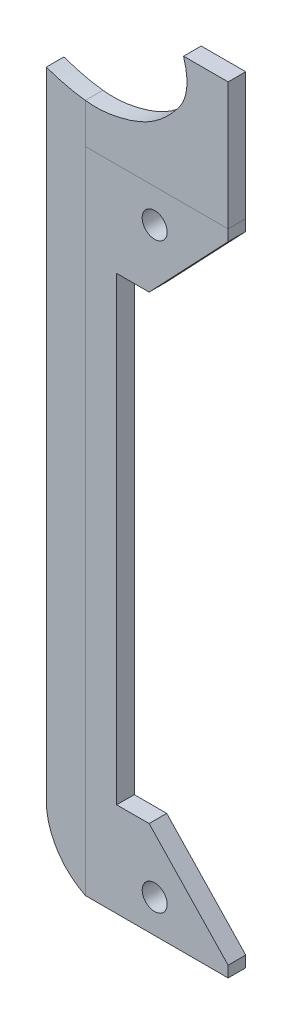
ISO-10303-21;
HEADER;
FILE_DESCRIPTION(('STEP AP214'),'2;1');
FILE_NAME('part.step','',(''),(''),'','','');
FILE_SCHEMA(('AUTOMOTIVE_DESIGN { 1 0 10303 214 1 1 1 1 }'));
ENDSEC;
DATA;
#1=APPLICATION_CONTEXT('core data for automotive mechanical design processes');
#2=APPLICATION_PROTOCOL_DEFINITION('international standard','automotive_design',2000,#1);
#3=PRODUCT_CONTEXT('',#1,'mechanical');
#4=PRODUCT('Part','Part','',(#3));
#5=PRODUCT_RELATED_PRODUCT_CATEGORY('part','',(#4));
#6=PRODUCT_DEFINITION_FORMATION('','',#4);
#7=PRODUCT_DEFINITION_CONTEXT('part definition',#1,'design');
#8=PRODUCT_DEFINITION('design','',#6,#7);
#9=PRODUCT_DEFINITION_SHAPE('','',#8);
#10=(LENGTH_UNIT() NAMED_UNIT(*) SI_UNIT(.MILLI.,.METRE.));
#11=(NAMED_UNIT(*) PLANE_ANGLE_UNIT() SI_UNIT($,.RADIAN.));
#12=(NAMED_UNIT(*) SI_UNIT($,.STERADIAN.) SOLID_ANGLE_UNIT());
#13=UNCERTAINTY_MEASURE_WITH_UNIT(LENGTH_MEASURE(1.E-05),#10,'distance_accuracy_value','');
#14=(GEOMETRIC_REPRESENTATION_CONTEXT(3) GLOBAL_UNCERTAINTY_ASSIGNED_CONTEXT((#13)) GLOBAL_UNIT_ASSIGNED_CONTEXT((#10,
#11,#12)) REPRESENTATION_CONTEXT('',''));
#15=CARTESIAN_POINT('',(0.,0.,0.));
#16=DIRECTION('',(0.,0.,1.));
#17=DIRECTION('',(1.,0.,0.));
#18=AXIS2_PLACEMENT_3D('',#15,#16,#17);
#19=CARTESIAN_POINT('',(0.,0.,3.17499999999992));
#20=DIRECTION('',(0.,0.,-1.));
#21=DIRECTION('',(-1.,0.,0.));
#22=AXIS2_PLACEMENT_3D('',#19,#20,#21);
#23=PLANE('',#22);
#24=DIRECTION('',(0.,1.,0.));
#25=VECTOR('',#24,1.);
#26=CARTESIAN_POINT('',(-497.05,1.49999999999986,3.17499999999995));
#27=LINE('',#26,#25);
#28=CARTESIAN_POINT('',(-497.05,12.8739834710622,3.17499999999992));
#29=VERTEX_POINT('',#28);
#30=CARTESIAN_POINT('',(-497.05,127.374197193381,3.17499999999989));
#31=VERTEX_POINT('',#30);
#32=EDGE_CURVE('E274',#29,#31,#27,.T.);
#33=ORIENTED_EDGE('',*,*,#32,.F.);
#34=CARTESIAN_POINT('',(-484.35,12.8739834710622,3.17499999999992));
#35=DIRECTION('',(0.,0.,-1.));
#36=DIRECTION('',(-1.,0.,0.));
#37=AXIS2_PLACEMENT_3D('',#34,#35,#36);
#38=CIRCLE('',#37,12.7);
#39=CARTESIAN_POINT('',(-490.,1.49999999999986,3.17499999999997));
#40=VERTEX_POINT('',#39);
#41=EDGE_CURVE('E223',#29,#40,#38,.F.);
#42=ORIENTED_EDGE('',*,*,#41,.T.);
#43=DIRECTION('',(0.,1.,0.));
#44=VECTOR('',#43,1.);
#45=CARTESIAN_POINT('',(-490.,1.49999999999986,3.17499999999997));
#46=LINE('',#45,#44);
#47=CARTESIAN_POINT('',(-490.,125.685646759831,3.17499999999996));
#48=VERTEX_POINT('',#47);
#49=EDGE_CURVE('E277',#40,#48,#46,.T.);
#50=ORIENTED_EDGE('',*,*,#49,.T.);
#51=CARTESIAN_POINT('',(-472.286101811835,141.459761952969,3.17499999999992));
#52=CARTESIAN_POINT('',(-471.839311887975,139.996705848872,3.17499999999992));
#53=CARTESIAN_POINT('',(-471.44648237646,137.633072790387,3.17499999999992));
#54=CARTESIAN_POINT('',(-472.167376182058,134.273923046449,3.17499999999992));
#55=CARTESIAN_POINT('',(-473.81996088809,132.089102364911,3.17499999999992));
#56=CARTESIAN_POINT('',(-476.035631474165,129.72626131313,3.17499999999992));
#57=CARTESIAN_POINT('',(-478.913541328163,127.696041035695,3.17499999999992));
#58=CARTESIAN_POINT('',(-482.871983039689,126.231214629087,3.17499999999992));
#59=CARTESIAN_POINT('',(-488.965357723436,125.016223815304,3.17499999999992));
#60=CARTESIAN_POINT('',(-493.945609682446,126.322089579912,3.17499999999992));
#61=CARTESIAN_POINT('',(-497.05,127.374197193381,3.17499999999992));
#62=B_SPLINE_CURVE_WITH_KNOTS('',3,(#51,#52,#53,#54,#55,#56,#57,#58,#59,#60,#61),.UNSPECIFIED.,
.F.,.F.,(4,1,1,1,1,1,1,1,4),(0.,0.129736074714372,0.200847285493994,0.285412728854933,
0.358404023451765,0.477149407655144,0.580374686409033,0.716214990321223,1.),.UNSPECIFIED.);
#63=EDGE_CURVE('E261',#48,#31,#62,.T.);
#64=ORIENTED_EDGE('',*,*,#63,.T.);
#65=EDGE_LOOP('',(#33,#42,#50,#64));
#66=FACE_BOUND('',#65,.T.);
#67=ADVANCED_FACE('F214',(#66),#23,.F.);
#68=CARTESIAN_POINT('',(0.,0.,0.));
#69=DIRECTION('',(0.,0.,-1.));
#70=DIRECTION('',(-1.,0.,0.));
#71=AXIS2_PLACEMENT_3D('',#68,#69,#70);
#72=PLANE('',#71);
#73=DIRECTION('',(0.,1.,0.));
#74=VECTOR('',#73,1.);
#75=CARTESIAN_POINT('',(-490.,1.49999999999986,0.));
#76=LINE('',#75,#74);
#77=CARTESIAN_POINT('',(-490.,1.49999999999986,0.));
#78=VERTEX_POINT('',#77);
#79=CARTESIAN_POINT('',(-490.,125.685646759831,0.));
#80=VERTEX_POINT('',#79);
#81=EDGE_CURVE('E268',#78,#80,#76,.T.);
#82=ORIENTED_EDGE('',*,*,#81,.F.);
#83=CARTESIAN_POINT('',(-484.35,12.8739834710622,0.));
#84=DIRECTION('',(0.,0.,-1.));
#85=DIRECTION('',(-1.,0.,0.));
#86=AXIS2_PLACEMENT_3D('',#83,#84,#85);
#87=CIRCLE('',#86,12.7);
#88=CARTESIAN_POINT('',(-497.05,12.8739834710622,0.));
#89=VERTEX_POINT('',#88);
#90=EDGE_CURVE('E13',#78,#89,#87,.T.);
#91=ORIENTED_EDGE('',*,*,#90,.T.);
#92=DIRECTION('',(0.,1.,0.));
#93=VECTOR('',#92,1.);
#94=CARTESIAN_POINT('',(-497.05,1.49999999999986,0.));
#95=LINE('',#94,#93);
#96=CARTESIAN_POINT('',(-497.05,127.374197193381,-1.12005588560687E-13));
#97=VERTEX_POINT('',#96);
#98=EDGE_CURVE('E270',#89,#97,#95,.T.);
#99=ORIENTED_EDGE('',*,*,#98,.T.);
#100=CARTESIAN_POINT('',(-472.286101811835,141.459761952969,0.));
#101=CARTESIAN_POINT('',(-471.839311887975,139.996705848872,0.));
#102=CARTESIAN_POINT('',(-471.44648237646,137.633072790387,0.));
#103=CARTESIAN_POINT('',(-472.167376182058,134.273923046449,0.));
#104=CARTESIAN_POINT('',(-473.81996088809,132.089102364911,0.));
#105=CARTESIAN_POINT('',(-476.035631474165,129.72626131313,0.));
#106=CARTESIAN_POINT('',(-478.913541328163,127.696041035695,0.));
#107=CARTESIAN_POINT('',(-482.871983039689,126.231214629087,0.));
#108=CARTESIAN_POINT('',(-488.965357723436,125.016223815304,0.));
#109=CARTESIAN_POINT('',(-493.945609682446,126.322089579912,0.));
#110=CARTESIAN_POINT('',(-497.05,127.374197193381,0.));
#111=B_SPLINE_CURVE_WITH_KNOTS('',3,(#100,#101,#102,#103,#104,#105,#106,#107,#108,#109,#110),
.UNSPECIFIED.,.F.,.F.,(4,1,1,1,1,1,1,1,4),(0.,0.129736074714372,0.200847285493994,
0.285412728854933,0.358404023451765,0.477149407655144,0.580374686409033,0.716214990321223,1.),.UNSPECIFIED.);
#112=EDGE_CURVE('E258',#80,#97,#111,.T.);
#113=ORIENTED_EDGE('',*,*,#112,.F.);
#114=EDGE_LOOP('',(#82,#91,#99,#113));
#115=FACE_BOUND('',#114,.T.);
#116=ADVANCED_FACE('F267',(#115),#72,.T.);
#117=CARTESIAN_POINT('',(-490.,1.49999999999986,0.));
#118=DIRECTION('',(1.,0.,0.));
#119=DIRECTION('',(0.,1.,0.));
#120=AXIS2_PLACEMENT_3D('',#117,#118,#119);
#121=PLANE('',#120);
#122=DIRECTION('',(0.,0.,-1.));
#123=VECTOR('',#122,1.);
#124=CARTESIAN_POINT('',(-490.,125.685646759831,6.858));
#125=LINE('',#124,#123);
#126=EDGE_CURVE('E254',#48,#80,#125,.T.);
#127=ORIENTED_EDGE('',*,*,#126,.F.);
#128=ORIENTED_EDGE('',*,*,#49,.F.);
#129=DIRECTION('',(0.,0.,1.));
#130=VECTOR('',#129,1.);
#131=CARTESIAN_POINT('',(-490.,1.49999999999986,0.));
#132=LINE('',#131,#130);
#133=EDGE_CURVE('E273',#78,#40,#132,.T.);
#134=ORIENTED_EDGE('',*,*,#133,.F.);
#135=ORIENTED_EDGE('',*,*,#81,.T.);
#136=EDGE_LOOP('',(#127,#128,#134,#135));
#137=FACE_BOUND('',#136,.T.);
#138=ADVANCED_FACE('F272',(#137),#121,.T.);
#139=CARTESIAN_POINT('',(-497.05,1.49999999999986,0.));
#140=DIRECTION('',(1.,0.,0.));
#141=DIRECTION('',(0.,0.,-1.));
#142=AXIS2_PLACEMENT_3D('',#139,#140,#141);
#143=PLANE('',#142);
#144=ORIENTED_EDGE('',*,*,#98,.F.);
#145=DIRECTION('',(0.,0.,-1.));
#146=VECTOR('',#145,1.);
#147=CARTESIAN_POINT('',(-497.05,12.8739834710622,0.));
#148=LINE('',#147,#146);
#149=EDGE_CURVE('E292',#89,#29,#148,.F.);
#150=ORIENTED_EDGE('',*,*,#149,.T.);
#151=ORIENTED_EDGE('',*,*,#32,.T.);
#152=DIRECTION('',(0.,0.,-1.));
#153=VECTOR('',#152,1.);
#154=CARTESIAN_POINT('',(-497.05,127.374197193381,6.858));
#155=LINE('',#154,#153);
#156=EDGE_CURVE('E289',#31,#97,#155,.T.);
#157=ORIENTED_EDGE('',*,*,#156,.T.);
#158=EDGE_LOOP('',(#144,#150,#151,#157));
#159=FACE_BOUND('',#158,.T.);
#160=ADVANCED_FACE('F299',(#159),#143,.F.);
#161=CARTESIAN_POINT('',(-472.286101811835,141.459761952969,6.858));
#162=CARTESIAN_POINT('',(-471.839311887975,139.996705848872,6.858));
#163=CARTESIAN_POINT('',(-471.44648237646,137.633072790387,6.858));
#164=CARTESIAN_POINT('',(-472.167376182058,134.273923046449,6.858));
#165=CARTESIAN_POINT('',(-473.81996088809,132.089102364911,6.858));
#166=CARTESIAN_POINT('',(-476.035631474165,129.72626131313,6.858));
#167=CARTESIAN_POINT('',(-478.913541328163,127.696041035695,6.858));
#168=CARTESIAN_POINT('',(-482.871983039689,126.231214629087,6.858));
#169=CARTESIAN_POINT('',(-488.965357723436,125.016223815304,6.858));
#170=CARTESIAN_POINT('',(-493.945609682446,126.322089579912,6.858));
#171=CARTESIAN_POINT('',(-497.05,127.374197193381,6.858));
#172=B_SPLINE_CURVE_WITH_KNOTS('',3,(#161,#162,#163,#164,#165,#166,#167,#168,#169,#170,#171),
.UNSPECIFIED.,.F.,.F.,(4,1,1,1,1,1,1,1,4),(0.,0.129736074714372,0.200847285493994,
0.285412728854933,0.358404023451765,0.477149407655144,0.580374686409033,0.716214990321223,1.),.UNSPECIFIED.);
#173=DIRECTION('',(0.,0.,-1.));
#174=VECTOR('',#173,1.);
#175=SURFACE_OF_LINEAR_EXTRUSION('',#172,#174);
#176=ORIENTED_EDGE('',*,*,#126,.T.);
#177=ORIENTED_EDGE('',*,*,#112,.T.);
#178=ORIENTED_EDGE('',*,*,#156,.F.);
#179=ORIENTED_EDGE('',*,*,#63,.F.);
#180=EDGE_LOOP('',(#176,#177,#178,#179));
#181=FACE_BOUND('',#180,.T.);
#182=ADVANCED_FACE('F256',(#181),#175,.F.);
#183=CARTESIAN_POINT('',(-484.35,12.8739834710622,0.));
#184=DIRECTION('',(0.,0.,-1.));
#185=DIRECTION('',(-1.,0.,0.));
#186=AXIS2_PLACEMENT_3D('',#183,#184,#185);
#187=CYLINDRICAL_SURFACE('',#186,12.7);
#188=ORIENTED_EDGE('',*,*,#90,.F.);
#189=ORIENTED_EDGE('',*,*,#133,.T.);
#190=ORIENTED_EDGE('',*,*,#41,.F.);
#191=ORIENTED_EDGE('',*,*,#149,.F.);
#192=EDGE_LOOP('',(#188,#189,#190,#191));
#193=FACE_BOUND('',#192,.T.);
#194=ADVANCED_FACE('F216',(#193),#187,.T.);
#195=CLOSED_SHELL('',(#67,#116,#138,#160,#182,#194));
#196=MANIFOLD_SOLID_BREP('B2',#195);
#197=CARTESIAN_POINT('',(0.,0.,3.17499999999997));
#198=DIRECTION('',(0.,0.,-1.));
#199=DIRECTION('',(-1.,0.,0.));
#200=AXIS2_PLACEMENT_3D('',#197,#198,#199);
#201=PLANE('',#200);
#202=DIRECTION('',(1.,0.,0.));
#203=VECTOR('',#202,1.);
#204=CARTESIAN_POINT('',(-490.,141.459761952969,3.17499999999996));
#205=LINE('',#204,#203);
#206=CARTESIAN_POINT('',(-472.286101811835,141.459761952969,3.17499999999997));
#207=VERTEX_POINT('',#206);
#208=CARTESIAN_POINT('',(-464.25,141.459761952969,3.17499999999998));
#209=VERTEX_POINT('',#208);
#210=EDGE_CURVE('E441',#207,#209,#205,.T.);
#211=ORIENTED_EDGE('',*,*,#210,.F.);
#212=CARTESIAN_POINT('',(-472.286101811835,141.459761952969,3.17499999999997));
#213=CARTESIAN_POINT('',(-471.839311887975,139.996705848872,3.17499999999997));
#214=CARTESIAN_POINT('',(-471.44648237646,137.633072790387,3.17499999999997));
#215=CARTESIAN_POINT('',(-472.167376182058,134.273923046449,3.17499999999997));
#216=CARTESIAN_POINT('',(-473.81996088809,132.089102364911,3.17499999999997));
#217=CARTESIAN_POINT('',(-476.035631474165,129.72626131313,3.17499999999997));
#218=CARTESIAN_POINT('',(-478.913541328163,127.696041035695,3.17499999999997));
#219=CARTESIAN_POINT('',(-482.871983039689,126.231214629087,3.17499999999997));
#220=CARTESIAN_POINT('',(-488.965357723436,125.016223815304,3.17499999999997));
#221=CARTESIAN_POINT('',(-493.945609682446,126.322089579912,3.17499999999997));
#222=CARTESIAN_POINT('',(-497.05,127.374197193381,3.17499999999997));
#223=B_SPLINE_CURVE_WITH_KNOTS('',3,(#212,#213,#214,#215,#216,#217,#218,#219,#220,#221,#222),
.UNSPECIFIED.,.F.,.F.,(4,1,1,1,1,1,1,1,4),(0.,0.129736074714372,0.200847285493994,
0.285412728854933,0.358404023451765,0.477149407655144,0.580374686409033,0.716214990321223,1.),.UNSPECIFIED.);
#224=CARTESIAN_POINT('',(-490.,125.685646759831,3.17499999999997));
#225=VERTEX_POINT('',#224);
#226=EDGE_CURVE('E391',#207,#225,#223,.T.);
#227=ORIENTED_EDGE('',*,*,#226,.T.);
#228=DIRECTION('',(0.,1.,0.));
#229=VECTOR('',#228,1.);
#230=CARTESIAN_POINT('',(-490.,118.5,3.17499999999997));
#231=LINE('',#230,#229);
#232=CARTESIAN_POINT('',(-490.,118.5,3.17499999999997));
#233=VERTEX_POINT('',#232);
#234=EDGE_CURVE('E459',#233,#225,#231,.T.);
#235=ORIENTED_EDGE('',*,*,#234,.F.);
#236=DIRECTION('',(1.,0.,0.));
#237=VECTOR('',#236,1.);
#238=CARTESIAN_POINT('',(-490.,118.5,3.17499999999997));
#239=LINE('',#238,#237);
#240=CARTESIAN_POINT('',(-464.25,118.5,3.17499999999997));
#241=VERTEX_POINT('',#240);
#242=EDGE_CURVE('E420',#233,#241,#239,.T.);
#243=ORIENTED_EDGE('',*,*,#242,.T.);
#244=DIRECTION('',(0.,1.,0.));
#245=VECTOR('',#244,1.);
#246=CARTESIAN_POINT('',(-464.25,118.5,3.17499999999997));
#247=LINE('',#246,#245);
#248=EDGE_CURVE('E453',#241,#209,#247,.T.);
#249=ORIENTED_EDGE('',*,*,#248,.T.);
#250=EDGE_LOOP('',(#211,#227,#235,#243,#249));
#251=FACE_BOUND('',#250,.T.);
#252=ADVANCED_FACE('F377',(#251),#201,.F.);
#253=CARTESIAN_POINT('',(0.,0.,0.));
#254=DIRECTION('',(0.,0.,-1.));
#255=DIRECTION('',(-1.,0.,0.));
#256=AXIS2_PLACEMENT_3D('',#253,#254,#255);
#257=PLANE('',#256);
#258=CARTESIAN_POINT('',(-472.286101811835,141.459761952969,0.));
#259=CARTESIAN_POINT('',(-471.839311887975,139.996705848872,0.));
#260=CARTESIAN_POINT('',(-471.44648237646,137.633072790387,0.));
#261=CARTESIAN_POINT('',(-472.167376182058,134.273923046449,0.));
#262=CARTESIAN_POINT('',(-473.81996088809,132.089102364911,0.));
#263=CARTESIAN_POINT('',(-476.035631474165,129.72626131313,0.));
#264=CARTESIAN_POINT('',(-478.913541328163,127.696041035695,0.));
#265=CARTESIAN_POINT('',(-482.871983039689,126.231214629087,0.));
#266=CARTESIAN_POINT('',(-488.965357723436,125.016223815304,0.));
#267=CARTESIAN_POINT('',(-493.945609682446,126.322089579912,0.));
#268=CARTESIAN_POINT('',(-497.05,127.374197193381,0.));
#269=B_SPLINE_CURVE_WITH_KNOTS('',3,(#258,#259,#260,#261,#262,#263,#264,#265,#266,#267,#268),
.UNSPECIFIED.,.F.,.F.,(4,1,1,1,1,1,1,1,4),(0.,0.129736074714372,0.200847285493994,
0.285412728854933,0.358404023451765,0.477149407655144,0.580374686409033,0.716214990321223,1.),.UNSPECIFIED.);
#270=CARTESIAN_POINT('',(-472.286101811835,141.459761952969,0.));
#271=VERTEX_POINT('',#270);
#272=CARTESIAN_POINT('',(-490.,125.685646759831,0.));
#273=VERTEX_POINT('',#272);
#274=EDGE_CURVE('E427',#271,#273,#269,.T.);
#275=ORIENTED_EDGE('',*,*,#274,.F.);
#276=DIRECTION('',(1.,0.,0.));
#277=VECTOR('',#276,1.);
#278=CARTESIAN_POINT('',(-490.,141.459761952969,0.));
#279=LINE('',#278,#277);
#280=CARTESIAN_POINT('',(-464.25,141.459761952969,0.));
#281=VERTEX_POINT('',#280);
#282=EDGE_CURVE('E384',#271,#281,#279,.T.);
#283=ORIENTED_EDGE('',*,*,#282,.T.);
#284=DIRECTION('',(0.,1.,0.));
#285=VECTOR('',#284,1.);
#286=CARTESIAN_POINT('',(-464.25,118.5,0.));
#287=LINE('',#286,#285);
#288=CARTESIAN_POINT('',(-464.25,118.5,0.));
#289=VERTEX_POINT('',#288);
#290=EDGE_CURVE('E451',#289,#281,#287,.T.);
#291=ORIENTED_EDGE('',*,*,#290,.F.);
#292=DIRECTION('',(1.,0.,0.));
#293=VECTOR('',#292,1.);
#294=CARTESIAN_POINT('',(-490.,118.5,0.));
#295=LINE('',#294,#293);
#296=CARTESIAN_POINT('',(-490.,118.5,0.));
#297=VERTEX_POINT('',#296);
#298=EDGE_CURVE('E471',#297,#289,#295,.T.);
#299=ORIENTED_EDGE('',*,*,#298,.F.);
#300=DIRECTION('',(0.,1.,0.));
#301=VECTOR('',#300,1.);
#302=CARTESIAN_POINT('',(-490.,118.5,0.));
#303=LINE('',#302,#301);
#304=EDGE_CURVE('E435',#297,#273,#303,.T.);
#305=ORIENTED_EDGE('',*,*,#304,.T.);
#306=EDGE_LOOP('',(#275,#283,#291,#299,#305));
#307=FACE_BOUND('',#306,.T.);
#308=ADVANCED_FACE('F433',(#307),#257,.T.);
#309=CARTESIAN_POINT('',(-490.,118.5,0.));
#310=DIRECTION('',(1.,0.,0.));
#311=DIRECTION('',(0.,0.,-1.));
#312=AXIS2_PLACEMENT_3D('',#309,#310,#311);
#313=PLANE('',#312);
#314=ORIENTED_EDGE('',*,*,#234,.T.);
#315=DIRECTION('',(0.,0.,-1.));
#316=VECTOR('',#315,1.);
#317=CARTESIAN_POINT('',(-490.,125.685646759831,6.858));
#318=LINE('',#317,#316);
#319=EDGE_CURVE('E425',#225,#273,#318,.T.);
#320=ORIENTED_EDGE('',*,*,#319,.T.);
#321=ORIENTED_EDGE('',*,*,#304,.F.);
#322=DIRECTION('',(0.,0.,1.));
#323=VECTOR('',#322,1.);
#324=CARTESIAN_POINT('',(-490.,118.5,0.));
#325=LINE('',#324,#323);
#326=EDGE_CURVE('E462',#297,#233,#325,.T.);
#327=ORIENTED_EDGE('',*,*,#326,.T.);
#328=EDGE_LOOP('',(#314,#320,#321,#327));
#329=FACE_BOUND('',#328,.T.);
#330=ADVANCED_FACE('F507',(#329),#313,.F.);
#331=CARTESIAN_POINT('',(-490.,141.459761952969,0.));
#332=DIRECTION('',(0.,-1.,0.));
#333=DIRECTION('',(0.,0.,-1.));
#334=AXIS2_PLACEMENT_3D('',#331,#332,#333);
#335=PLANE('',#334);
#336=ORIENTED_EDGE('',*,*,#282,.F.);
#337=DIRECTION('',(0.,0.,-1.));
#338=VECTOR('',#337,1.);
#339=CARTESIAN_POINT('',(-472.286101811835,141.459761952969,6.858));
#340=LINE('',#339,#338);
#341=EDGE_CURVE('E212',#271,#207,#340,.F.);
#342=ORIENTED_EDGE('',*,*,#341,.T.);
#343=ORIENTED_EDGE('',*,*,#210,.T.);
#344=DIRECTION('',(0.,0.,1.));
#345=VECTOR('',#344,1.);
#346=CARTESIAN_POINT('',(-464.25,141.459761952969,0.));
#347=LINE('',#346,#345);
#348=EDGE_CURVE('E440',#281,#209,#347,.T.);
#349=ORIENTED_EDGE('',*,*,#348,.F.);
#350=EDGE_LOOP('',(#336,#342,#343,#349));
#351=FACE_BOUND('',#350,.T.);
#352=ADVANCED_FACE('F438',(#351),#335,.F.);
#353=CARTESIAN_POINT('',(-490.,118.5,0.));
#354=DIRECTION('',(0.,-1.,0.));
#355=DIRECTION('',(1.,0.,0.));
#356=AXIS2_PLACEMENT_3D('',#353,#354,#355);
#357=PLANE('',#356);
#358=ORIENTED_EDGE('',*,*,#242,.F.);
#359=ORIENTED_EDGE('',*,*,#326,.F.);
#360=ORIENTED_EDGE('',*,*,#298,.T.);
#361=DIRECTION('',(0.,0.,1.));
#362=VECTOR('',#361,1.);
#363=CARTESIAN_POINT('',(-464.25,118.5,0.));
#364=LINE('',#363,#362);
#365=EDGE_CURVE('E468',#289,#241,#364,.T.);
#366=ORIENTED_EDGE('',*,*,#365,.T.);
#367=EDGE_LOOP('',(#358,#359,#360,#366));
#368=FACE_BOUND('',#367,.T.);
#369=ADVANCED_FACE('F510',(#368),#357,.T.);
#370=CARTESIAN_POINT('',(-464.25,118.5,0.));
#371=DIRECTION('',(1.,0.,0.));
#372=DIRECTION('',(0.,0.,-1.));
#373=AXIS2_PLACEMENT_3D('',#370,#371,#372);
#374=PLANE('',#373);
#375=ORIENTED_EDGE('',*,*,#248,.F.);
#376=ORIENTED_EDGE('',*,*,#365,.F.);
#377=ORIENTED_EDGE('',*,*,#290,.T.);
#378=ORIENTED_EDGE('',*,*,#348,.T.);
#379=EDGE_LOOP('',(#375,#376,#377,#378));
#380=FACE_BOUND('',#379,.T.);
#381=ADVANCED_FACE('F506',(#380),#374,.T.);
#382=CARTESIAN_POINT('',(-472.286101811835,141.459761952969,6.858));
#383=CARTESIAN_POINT('',(-471.839311887975,139.996705848872,6.858));
#384=CARTESIAN_POINT('',(-471.44648237646,137.633072790387,6.858));
#385=CARTESIAN_POINT('',(-472.167376182058,134.273923046449,6.858));
#386=CARTESIAN_POINT('',(-473.81996088809,132.089102364911,6.858));
#387=CARTESIAN_POINT('',(-476.035631474165,129.72626131313,6.858));
#388=CARTESIAN_POINT('',(-478.913541328163,127.696041035695,6.858));
#389=CARTESIAN_POINT('',(-482.871983039689,126.231214629087,6.858));
#390=CARTESIAN_POINT('',(-488.965357723436,125.016223815304,6.858));
#391=CARTESIAN_POINT('',(-493.945609682446,126.322089579912,6.858));
#392=CARTESIAN_POINT('',(-497.05,127.374197193381,6.858));
#393=B_SPLINE_CURVE_WITH_KNOTS('',3,(#382,#383,#384,#385,#386,#387,#388,#389,#390,#391,#392),
.UNSPECIFIED.,.F.,.F.,(4,1,1,1,1,1,1,1,4),(0.,0.129736074714372,0.200847285493994,
0.285412728854933,0.358404023451765,0.477149407655144,0.580374686409033,0.716214990321223,1.),.UNSPECIFIED.);
#394=DIRECTION('',(0.,0.,-1.));
#395=VECTOR('',#394,1.);
#396=SURFACE_OF_LINEAR_EXTRUSION('',#393,#395);
#397=ORIENTED_EDGE('',*,*,#341,.F.);
#398=ORIENTED_EDGE('',*,*,#274,.T.);
#399=ORIENTED_EDGE('',*,*,#319,.F.);
#400=ORIENTED_EDGE('',*,*,#226,.F.);
#401=EDGE_LOOP('',(#397,#398,#399,#400));
#402=FACE_BOUND('',#401,.T.);
#403=ADVANCED_FACE('F429',(#402),#396,.F.);
#404=CLOSED_SHELL('',(#252,#308,#330,#352,#369,#381,#403));
#405=MANIFOLD_SOLID_BREP('B7',#404);
#406=CARTESIAN_POINT('',(0.,0.,3.17499999999997));
#407=DIRECTION('',(0.,0.,-1.));
#408=DIRECTION('',(-1.,0.,0.));
#409=AXIS2_PLACEMENT_3D('',#406,#407,#408);
#410=PLANE('',#409);
#411=CARTESIAN_POINT('',(-477.5,7.49999999999986,3.17499999999997));
#412=DIRECTION('',(0.,0.,1.));
#413=DIRECTION('',(1.,0.,0.));
#414=AXIS2_PLACEMENT_3D('',#411,#412,#413);
#415=CIRCLE('',#414,2.24999999999995);
#416=CARTESIAN_POINT('',(-475.25,7.49999999999986,3.17499999999997));
#417=VERTEX_POINT('',#416);
#418=EDGE_CURVE('E793',#417,#417,#415,.T.);
#419=ORIENTED_EDGE('',*,*,#418,.F.);
#420=EDGE_LOOP('',(#419));
#421=FACE_BOUND('',#420,.T.);
#422=CARTESIAN_POINT('',(-477.5,112.5,3.17499999999997));
#423=DIRECTION('',(0.,0.,1.));
#424=DIRECTION('',(1.,0.,0.));
#425=AXIS2_PLACEMENT_3D('',#422,#423,#424);
#426=CIRCLE('',#425,2.24999999999995);
#427=CARTESIAN_POINT('',(-475.25,112.5,3.17499999999997));
#428=VERTEX_POINT('',#427);
#429=EDGE_CURVE('E771',#428,#428,#426,.T.);
#430=ORIENTED_EDGE('',*,*,#429,.F.);
#431=EDGE_LOOP('',(#430));
#432=FACE_BOUND('',#431,.T.);
#433=DIRECTION('',(0.688749461914693,0.724999433594414,0.));
#434=VECTOR('',#433,1.);
#435=CARTESIAN_POINT('',(-478.5,101.5,3.17499999999997));
#436=LINE('',#435,#434);
#437=CARTESIAN_POINT('',(-478.5,101.5,3.17499999999997));
#438=VERTEX_POINT('',#437);
#439=CARTESIAN_POINT('',(-464.25,116.5,3.17499999999997));
#440=VERTEX_POINT('',#439);
#441=EDGE_CURVE('E574',#438,#440,#436,.T.);
#442=ORIENTED_EDGE('',*,*,#441,.T.);
#443=DIRECTION('',(0.,1.,0.));
#444=VECTOR('',#443,1.);
#445=CARTESIAN_POINT('',(-464.25,116.5,3.17499999999997));
#446=LINE('',#445,#444);
#447=CARTESIAN_POINT('',(-464.25,118.5,3.17499999999999));
#448=VERTEX_POINT('',#447);
#449=EDGE_CURVE('E659',#440,#448,#446,.T.);
#450=ORIENTED_EDGE('',*,*,#449,.T.);
#451=DIRECTION('',(-1.,0.,0.));
#452=VECTOR('',#451,1.);
#453=CARTESIAN_POINT('',(-464.25,118.5,3.17499999999999));
#454=LINE('',#453,#452);
#455=CARTESIAN_POINT('',(-490.,118.5,3.17499999999997));
#456=VERTEX_POINT('',#455);
#457=EDGE_CURVE('E684',#448,#456,#454,.T.);
#458=ORIENTED_EDGE('',*,*,#457,.T.);
#459=DIRECTION('',(0.,-1.,0.));
#460=VECTOR('',#459,1.);
#461=CARTESIAN_POINT('',(-490.,118.5,3.17499999999997));
#462=LINE('',#461,#460);
#463=CARTESIAN_POINT('',(-490.,1.49999999999987,3.17499999999997));
#464=VERTEX_POINT('',#463);
#465=EDGE_CURVE('E696',#456,#464,#462,.T.);
#466=ORIENTED_EDGE('',*,*,#465,.T.);
#467=DIRECTION('',(1.,0.,0.));
#468=VECTOR('',#467,1.);
#469=CARTESIAN_POINT('',(-490.,1.49999999999986,3.17499999999997));
#470=LINE('',#469,#468);
#471=CARTESIAN_POINT('',(-464.25,1.49999999999986,3.17499999999997));
#472=VERTEX_POINT('',#471);
#473=EDGE_CURVE('E710',#464,#472,#470,.T.);
#474=ORIENTED_EDGE('',*,*,#473,.T.);
#475=DIRECTION('',(0.,-1.,0.));
#476=VECTOR('',#475,1.);
#477=CARTESIAN_POINT('',(-464.25,3.49999999999986,3.17499999999997));
#478=LINE('',#477,#476);
#479=CARTESIAN_POINT('',(-464.25,3.49999999999986,3.17499999999997));
#480=VERTEX_POINT('',#479);
#481=EDGE_CURVE('E723',#480,#472,#478,.T.);
#482=ORIENTED_EDGE('',*,*,#481,.F.);
#483=DIRECTION('',(-0.688749461914693,0.724999433594414,0.));
#484=VECTOR('',#483,1.);
#485=CARTESIAN_POINT('',(-464.25,3.49999999999986,3.17499999999997));
#486=LINE('',#485,#484);
#487=CARTESIAN_POINT('',(-478.5,18.4999999999999,3.17499999999997));
#488=VERTEX_POINT('',#487);
#489=EDGE_CURVE('E612',#480,#488,#486,.T.);
#490=ORIENTED_EDGE('',*,*,#489,.T.);
#491=DIRECTION('',(-1.,0.,0.));
#492=VECTOR('',#491,1.);
#493=CARTESIAN_POINT('',(-478.5,18.4999999999999,3.17499999999997));
#494=LINE('',#493,#492);
#495=CARTESIAN_POINT('',(-484.35,18.4999999999999,3.17499999999997));
#496=VERTEX_POINT('',#495);
#497=EDGE_CURVE('E606',#488,#496,#494,.T.);
#498=ORIENTED_EDGE('',*,*,#497,.T.);
#499=DIRECTION('',(0.,1.,0.));
#500=VECTOR('',#499,1.);
#501=CARTESIAN_POINT('',(-484.35,18.4999999999999,3.17499999999997));
#502=LINE('',#501,#500);
#503=CARTESIAN_POINT('',(-484.35,101.5,3.17499999999997));
#504=VERTEX_POINT('',#503);
#505=EDGE_CURVE('E601',#496,#504,#502,.T.);
#506=ORIENTED_EDGE('',*,*,#505,.T.);
#507=DIRECTION('',(1.,0.,0.));
#508=VECTOR('',#507,1.);
#509=CARTESIAN_POINT('',(-484.35,101.5,3.17499999999997));
#510=LINE('',#509,#508);
#511=EDGE_CURVE('E595',#504,#438,#510,.T.);
#512=ORIENTED_EDGE('',*,*,#511,.T.);
#513=EDGE_LOOP('',(#442,#450,#458,#466,#474,#482,#490,#498,#506,#512));
#514=FACE_BOUND('',#513,.T.);
#515=ADVANCED_FACE('F565',(#421,#432,#514),#410,.F.);
#516=CARTESIAN_POINT('',(0.,0.,0.));
#517=DIRECTION('',(0.,0.,-1.));
#518=DIRECTION('',(-1.,0.,0.));
#519=AXIS2_PLACEMENT_3D('',#516,#517,#518);
#520=PLANE('',#519);
#521=CARTESIAN_POINT('',(-477.5,7.49999999999986,0.));
#522=DIRECTION('',(0.,0.,1.));
#523=DIRECTION('',(1.,0.,0.));
#524=AXIS2_PLACEMENT_3D('',#521,#522,#523);
#525=CIRCLE('',#524,2.24999999999995);
#526=CARTESIAN_POINT('',(-475.25,7.49999999999986,0.));
#527=VERTEX_POINT('',#526);
#528=EDGE_CURVE('E796',#527,#527,#525,.T.);
#529=ORIENTED_EDGE('',*,*,#528,.T.);
#530=EDGE_LOOP('',(#529));
#531=FACE_BOUND('',#530,.T.);
#532=CARTESIAN_POINT('',(-477.5,112.5,0.));
#533=DIRECTION('',(0.,0.,1.));
#534=DIRECTION('',(1.,0.,0.));
#535=AXIS2_PLACEMENT_3D('',#532,#533,#534);
#536=CIRCLE('',#535,2.24999999999995);
#537=CARTESIAN_POINT('',(-475.25,112.5,0.));
#538=VERTEX_POINT('',#537);
#539=EDGE_CURVE('E774',#538,#538,#536,.T.);
#540=ORIENTED_EDGE('',*,*,#539,.T.);
#541=EDGE_LOOP('',(#540));
#542=FACE_BOUND('',#541,.T.);
#543=DIRECTION('',(0.688749461914693,0.724999433594414,0.));
#544=VECTOR('',#543,1.);
#545=CARTESIAN_POINT('',(-478.5,101.5,0.));
#546=LINE('',#545,#544);
#547=CARTESIAN_POINT('',(-478.5,101.5,0.));
#548=VERTEX_POINT('',#547);
#549=CARTESIAN_POINT('',(-464.25,116.5,0.));
#550=VERTEX_POINT('',#549);
#551=EDGE_CURVE('E375',#548,#550,#546,.T.);
#552=ORIENTED_EDGE('',*,*,#551,.F.);
#553=DIRECTION('',(1.,0.,0.));
#554=VECTOR('',#553,1.);
#555=CARTESIAN_POINT('',(-484.35,101.5,0.));
#556=LINE('',#555,#554);
#557=CARTESIAN_POINT('',(-484.35,101.5,0.));
#558=VERTEX_POINT('',#557);
#559=EDGE_CURVE('E766',#558,#548,#556,.T.);
#560=ORIENTED_EDGE('',*,*,#559,.F.);
#561=DIRECTION('',(0.,1.,0.));
#562=VECTOR('',#561,1.);
#563=CARTESIAN_POINT('',(-484.35,18.4999999999999,0.));
#564=LINE('',#563,#562);
#565=CARTESIAN_POINT('',(-484.35,18.4999999999999,0.));
#566=VERTEX_POINT('',#565);
#567=EDGE_CURVE('E621',#566,#558,#564,.T.);
#568=ORIENTED_EDGE('',*,*,#567,.F.);
#569=DIRECTION('',(-1.,0.,0.));
#570=VECTOR('',#569,1.);
#571=CARTESIAN_POINT('',(-478.5,18.4999999999999,0.));
#572=LINE('',#571,#570);
#573=CARTESIAN_POINT('',(-478.5,18.4999999999999,0.));
#574=VERTEX_POINT('',#573);
#575=EDGE_CURVE('E626',#574,#566,#572,.T.);
#576=ORIENTED_EDGE('',*,*,#575,.F.);
#577=DIRECTION('',(-0.688749461914693,0.724999433594414,0.));
#578=VECTOR('',#577,1.);
#579=CARTESIAN_POINT('',(-464.25,3.49999999999986,0.));
#580=LINE('',#579,#578);
#581=CARTESIAN_POINT('',(-464.25,3.49999999999986,0.));
#582=VERTEX_POINT('',#581);
#583=EDGE_CURVE('E632',#582,#574,#580,.T.);
#584=ORIENTED_EDGE('',*,*,#583,.F.);
#585=DIRECTION('',(0.,-1.,0.));
#586=VECTOR('',#585,1.);
#587=CARTESIAN_POINT('',(-464.25,3.49999999999986,0.));
#588=LINE('',#587,#586);
#589=CARTESIAN_POINT('',(-464.25,1.49999999999986,0.));
#590=VERTEX_POINT('',#589);
#591=EDGE_CURVE('E721',#582,#590,#588,.T.);
#592=ORIENTED_EDGE('',*,*,#591,.T.);
#593=DIRECTION('',(1.,0.,0.));
#594=VECTOR('',#593,1.);
#595=CARTESIAN_POINT('',(-490.,1.49999999999986,0.));
#596=LINE('',#595,#594);
#597=CARTESIAN_POINT('',(-490.,1.49999999999987,0.));
#598=VERTEX_POINT('',#597);
#599=EDGE_CURVE('E704',#598,#590,#596,.T.);
#600=ORIENTED_EDGE('',*,*,#599,.F.);
#601=DIRECTION('',(0.,-1.,0.));
#602=VECTOR('',#601,1.);
#603=CARTESIAN_POINT('',(-490.,118.5,0.));
#604=LINE('',#603,#602);
#605=CARTESIAN_POINT('',(-490.,118.5,0.));
#606=VERTEX_POINT('',#605);
#607=EDGE_CURVE('E690',#606,#598,#604,.T.);
#608=ORIENTED_EDGE('',*,*,#607,.F.);
#609=DIRECTION('',(-1.,0.,0.));
#610=VECTOR('',#609,1.);
#611=CARTESIAN_POINT('',(-464.25,118.5,0.));
#612=LINE('',#611,#610);
#613=CARTESIAN_POINT('',(-464.25,118.5,0.));
#614=VERTEX_POINT('',#613);
#615=EDGE_CURVE('E674',#614,#606,#612,.T.);
#616=ORIENTED_EDGE('',*,*,#615,.F.);
#617=DIRECTION('',(0.,1.,0.));
#618=VECTOR('',#617,1.);
#619=CARTESIAN_POINT('',(-464.25,116.5,0.));
#620=LINE('',#619,#618);
#621=EDGE_CURVE('E662',#550,#614,#620,.T.);
#622=ORIENTED_EDGE('',*,*,#621,.F.);
#623=EDGE_LOOP('',(#552,#560,#568,#576,#584,#592,#600,#608,#616,#622));
#624=FACE_BOUND('',#623,.T.);
#625=ADVANCED_FACE('F800',(#531,#542,#624),#520,.T.);
#626=CARTESIAN_POINT('',(-484.35,101.5,0.));
#627=DIRECTION('',(0.,-1.,0.));
#628=DIRECTION('',(0.,0.,-1.));
#629=AXIS2_PLACEMENT_3D('',#626,#627,#628);
#630=PLANE('',#629);
#631=ORIENTED_EDGE('',*,*,#511,.F.);
#632=DIRECTION('',(0.,0.,1.));
#633=VECTOR('',#632,1.);
#634=CARTESIAN_POINT('',(-484.35,101.5,0.));
#635=LINE('',#634,#633);
#636=EDGE_CURVE('E765',#558,#504,#635,.T.);
#637=ORIENTED_EDGE('',*,*,#636,.F.);
#638=ORIENTED_EDGE('',*,*,#559,.T.);
#639=DIRECTION('',(0.,0.,1.));
#640=VECTOR('',#639,1.);
#641=CARTESIAN_POINT('',(-478.5,101.5,0.));
#642=LINE('',#641,#640);
#643=EDGE_CURVE('E763',#548,#438,#642,.T.);
#644=ORIENTED_EDGE('',*,*,#643,.T.);
#645=EDGE_LOOP('',(#631,#637,#638,#644));
#646=FACE_BOUND('',#645,.T.);
#647=ADVANCED_FACE('F825',(#646),#630,.T.);
#648=CARTESIAN_POINT('',(-484.35,18.4999999999999,0.));
#649=DIRECTION('',(1.,0.,0.));
#650=DIRECTION('',(0.,1.,0.));
#651=AXIS2_PLACEMENT_3D('',#648,#649,#650);
#652=PLANE('',#651);
#653=ORIENTED_EDGE('',*,*,#505,.F.);
#654=DIRECTION('',(0.,0.,1.));
#655=VECTOR('',#654,1.);
#656=CARTESIAN_POINT('',(-484.35,18.4999999999999,0.));
#657=LINE('',#656,#655);
#658=EDGE_CURVE('E755',#566,#496,#657,.T.);
#659=ORIENTED_EDGE('',*,*,#658,.F.);
#660=ORIENTED_EDGE('',*,*,#567,.T.);
#661=ORIENTED_EDGE('',*,*,#636,.T.);
#662=EDGE_LOOP('',(#653,#659,#660,#661));
#663=FACE_BOUND('',#662,.T.);
#664=ADVANCED_FACE('F828',(#663),#652,.T.);
#665=CARTESIAN_POINT('',(-478.5,18.4999999999999,0.));
#666=DIRECTION('',(0.,1.,0.));
#667=DIRECTION('',(-1.,0.,0.));
#668=AXIS2_PLACEMENT_3D('',#665,#666,#667);
#669=PLANE('',#668);
#670=ORIENTED_EDGE('',*,*,#497,.F.);
#671=DIRECTION('',(0.,0.,1.));
#672=VECTOR('',#671,1.);
#673=CARTESIAN_POINT('',(-478.5,18.4999999999999,0.));
#674=LINE('',#673,#672);
#675=EDGE_CURVE('E745',#574,#488,#674,.T.);
#676=ORIENTED_EDGE('',*,*,#675,.F.);
#677=ORIENTED_EDGE('',*,*,#575,.T.);
#678=ORIENTED_EDGE('',*,*,#658,.T.);
#679=EDGE_LOOP('',(#670,#676,#677,#678));
#680=FACE_BOUND('',#679,.T.);
#681=ADVANCED_FACE('F832',(#680),#669,.T.);
#682=CARTESIAN_POINT('',(-464.25,3.49999999999986,0.));
#683=DIRECTION('',(0.724999433594414,0.688749461914693,0.));
#684=DIRECTION('',(-0.688749461914693,0.724999433594414,0.));
#685=AXIS2_PLACEMENT_3D('',#682,#683,#684);
#686=PLANE('',#685);
#687=ORIENTED_EDGE('',*,*,#489,.F.);
#688=DIRECTION('',(0.,0.,1.));
#689=VECTOR('',#688,1.);
#690=CARTESIAN_POINT('',(-464.25,3.49999999999986,0.));
#691=LINE('',#690,#689);
#692=EDGE_CURVE('E734',#582,#480,#691,.T.);
#693=ORIENTED_EDGE('',*,*,#692,.F.);
#694=ORIENTED_EDGE('',*,*,#583,.T.);
#695=ORIENTED_EDGE('',*,*,#675,.T.);
#696=EDGE_LOOP('',(#687,#693,#694,#695));
#697=FACE_BOUND('',#696,.T.);
#698=ADVANCED_FACE('F835',(#697),#686,.T.);
#699=CARTESIAN_POINT('',(-490.,1.49999999999986,0.));
#700=DIRECTION('',(0.,-1.,0.));
#701=DIRECTION('',(1.,0.,0.));
#702=AXIS2_PLACEMENT_3D('',#699,#700,#701);
#703=PLANE('',#702);
#704=ORIENTED_EDGE('',*,*,#473,.F.);
#705=DIRECTION('',(0.,0.,1.));
#706=VECTOR('',#705,1.);
#707=CARTESIAN_POINT('',(-490.,1.49999999999986,0.));
#708=LINE('',#707,#706);
#709=EDGE_CURVE('E707',#598,#464,#708,.T.);
#710=ORIENTED_EDGE('',*,*,#709,.F.);
#711=ORIENTED_EDGE('',*,*,#599,.T.);
#712=DIRECTION('',(0.,0.,1.));
#713=VECTOR('',#712,1.);
#714=CARTESIAN_POINT('',(-464.25,1.49999999999986,0.));
#715=LINE('',#714,#713);
#716=EDGE_CURVE('E718',#590,#472,#715,.T.);
#717=ORIENTED_EDGE('',*,*,#716,.T.);
#718=EDGE_LOOP('',(#704,#710,#711,#717));
#719=FACE_BOUND('',#718,.T.);
#720=ADVANCED_FACE('F838',(#719),#703,.T.);
#721=CARTESIAN_POINT('',(-490.,118.5,0.));
#722=DIRECTION('',(-1.,0.,0.));
#723=DIRECTION('',(0.,-1.,0.));
#724=AXIS2_PLACEMENT_3D('',#721,#722,#723);
#725=PLANE('',#724);
#726=ORIENTED_EDGE('',*,*,#465,.F.);
#727=DIRECTION('',(0.,0.,1.));
#728=VECTOR('',#727,1.);
#729=CARTESIAN_POINT('',(-490.,118.5,0.));
#730=LINE('',#729,#728);
#731=EDGE_CURVE('E693',#606,#456,#730,.T.);
#732=ORIENTED_EDGE('',*,*,#731,.F.);
#733=ORIENTED_EDGE('',*,*,#607,.T.);
#734=ORIENTED_EDGE('',*,*,#709,.T.);
#735=EDGE_LOOP('',(#726,#732,#733,#734));
#736=FACE_BOUND('',#735,.T.);
#737=ADVANCED_FACE('F843',(#736),#725,.T.);
#738=CARTESIAN_POINT('',(-464.25,118.5,0.));
#739=DIRECTION('',(0.,1.,0.));
#740=DIRECTION('',(-1.,0.,0.));
#741=AXIS2_PLACEMENT_3D('',#738,#739,#740);
#742=PLANE('',#741);
#743=ORIENTED_EDGE('',*,*,#457,.F.);
#744=DIRECTION('',(0.,0.,1.));
#745=VECTOR('',#744,1.);
#746=CARTESIAN_POINT('',(-464.25,118.5,0.));
#747=LINE('',#746,#745);
#748=EDGE_CURVE('E672',#614,#448,#747,.T.);
#749=ORIENTED_EDGE('',*,*,#748,.F.);
#750=ORIENTED_EDGE('',*,*,#615,.T.);
#751=ORIENTED_EDGE('',*,*,#731,.T.);
#752=EDGE_LOOP('',(#743,#749,#750,#751));
#753=FACE_BOUND('',#752,.T.);
#754=ADVANCED_FACE('F847',(#753),#742,.T.);
#755=CARTESIAN_POINT('',(-464.25,116.5,0.));
#756=DIRECTION('',(1.,0.,0.));
#757=DIRECTION('',(0.,0.,-1.));
#758=AXIS2_PLACEMENT_3D('',#755,#756,#757);
#759=PLANE('',#758);
#760=ORIENTED_EDGE('',*,*,#449,.F.);
#761=DIRECTION('',(0.,0.,1.));
#762=VECTOR('',#761,1.);
#763=CARTESIAN_POINT('',(-464.25,116.5,0.));
#764=LINE('',#763,#762);
#765=EDGE_CURVE('E665',#550,#440,#764,.T.);
#766=ORIENTED_EDGE('',*,*,#765,.F.);
#767=ORIENTED_EDGE('',*,*,#621,.T.);
#768=ORIENTED_EDGE('',*,*,#748,.T.);
#769=EDGE_LOOP('',(#760,#766,#767,#768));
#770=FACE_BOUND('',#769,.T.);
#771=ADVANCED_FACE('F670',(#770),#759,.T.);
#772=CARTESIAN_POINT('',(-478.5,101.5,0.));
#773=DIRECTION('',(0.724999433594414,-0.688749461914693,0.));
#774=DIRECTION('',(0.688749461914693,0.724999433594414,0.));
#775=AXIS2_PLACEMENT_3D('',#772,#773,#774);
#776=PLANE('',#775);
#777=ORIENTED_EDGE('',*,*,#441,.F.);
#778=ORIENTED_EDGE('',*,*,#643,.F.);
#779=ORIENTED_EDGE('',*,*,#551,.T.);
#780=ORIENTED_EDGE('',*,*,#765,.T.);
#781=EDGE_LOOP('',(#777,#778,#779,#780));
#782=FACE_BOUND('',#781,.T.);
#783=ADVANCED_FACE('F666',(#782),#776,.T.);
#784=CARTESIAN_POINT('',(-464.25,3.49999999999986,0.));
#785=DIRECTION('',(-1.,0.,0.));
#786=DIRECTION('',(0.,0.,1.));
#787=AXIS2_PLACEMENT_3D('',#784,#785,#786);
#788=PLANE('',#787);
#789=ORIENTED_EDGE('',*,*,#481,.T.);
#790=ORIENTED_EDGE('',*,*,#716,.F.);
#791=ORIENTED_EDGE('',*,*,#591,.F.);
#792=ORIENTED_EDGE('',*,*,#692,.T.);
#793=EDGE_LOOP('',(#789,#790,#791,#792));
#794=FACE_BOUND('',#793,.T.);
#795=ADVANCED_FACE('F815',(#794),#788,.F.);
#796=CARTESIAN_POINT('',(-477.5,112.5,0.));
#797=DIRECTION('',(0.,0.,1.));
#798=DIRECTION('',(1.,0.,0.));
#799=AXIS2_PLACEMENT_3D('',#796,#797,#798);
#800=CYLINDRICAL_SURFACE('',#799,2.24999999999995);
#801=ORIENTED_EDGE('',*,*,#539,.F.);
#802=EDGE_LOOP('',(#801));
#803=FACE_BOUND('',#802,.T.);
#804=ORIENTED_EDGE('',*,*,#429,.T.);
#805=EDGE_LOOP('',(#804));
#806=FACE_BOUND('',#805,.T.);
#807=ADVANCED_FACE('F806',(#803,#806),#800,.F.);
#808=CARTESIAN_POINT('',(-477.5,7.49999999999986,0.));
#809=DIRECTION('',(0.,0.,1.));
#810=DIRECTION('',(1.,0.,0.));
#811=AXIS2_PLACEMENT_3D('',#808,#809,#810);
#812=CYLINDRICAL_SURFACE('',#811,2.24999999999995);
#813=ORIENTED_EDGE('',*,*,#528,.F.);
#814=EDGE_LOOP('',(#813));
#815=FACE_BOUND('',#814,.T.);
#816=ORIENTED_EDGE('',*,*,#418,.T.);
#817=EDGE_LOOP('',(#816));
#818=FACE_BOUND('',#817,.T.);
#819=ADVANCED_FACE('F803',(#815,#818),#812,.F.);
#820=CLOSED_SHELL('',(#515,#625,#647,#664,#681,#698,#720,#737,#754,#771,#783,#795,#807,#819));
#821=MANIFOLD_SOLID_BREP('B206',#820);
#822=ADVANCED_BREP_SHAPE_REPRESENTATION('',(#18,#196,#405,#821),#14);
#823=SHAPE_DEFINITION_REPRESENTATION(#9,#822);
ENDSEC;
END-ISO-10303-21;
